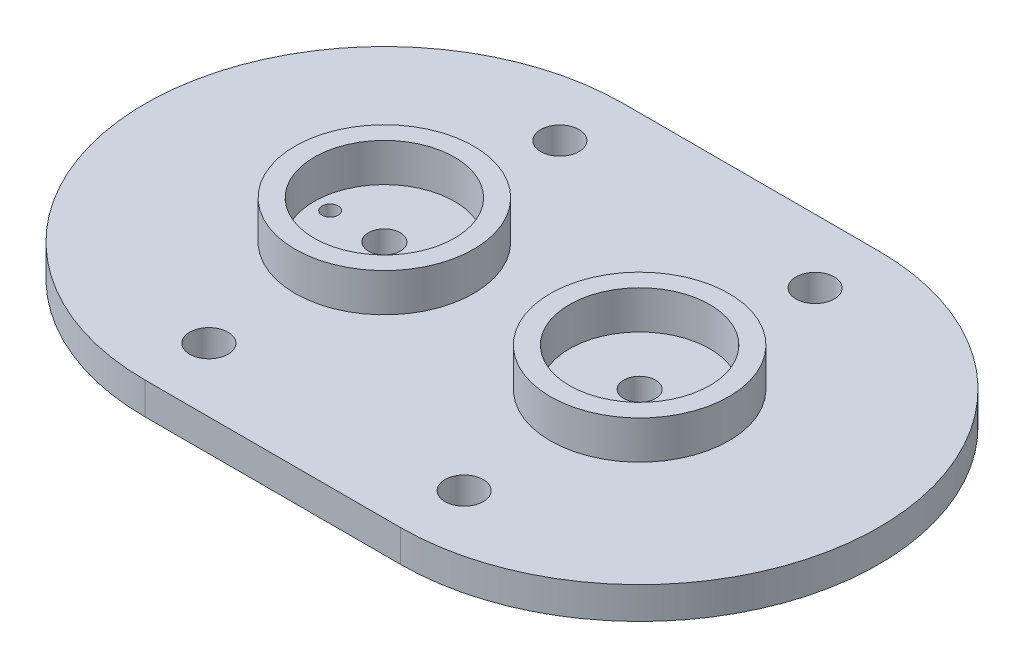
ISO-10303-21;
HEADER;
FILE_DESCRIPTION(('STEP AP214'),'2;1');
FILE_NAME('part.step','',(''),(''),'','','');
FILE_SCHEMA(('AUTOMOTIVE_DESIGN { 1 0 10303 214 1 1 1 1 }'));
ENDSEC;
DATA;
#1=APPLICATION_CONTEXT('core data for automotive mechanical design processes');
#2=APPLICATION_PROTOCOL_DEFINITION('international standard','automotive_design',2000,#1);
#3=PRODUCT_CONTEXT('',#1,'mechanical');
#4=PRODUCT('Part','Part','',(#3));
#5=PRODUCT_RELATED_PRODUCT_CATEGORY('part','',(#4));
#6=PRODUCT_DEFINITION_FORMATION('','',#4);
#7=PRODUCT_DEFINITION_CONTEXT('part definition',#1,'design');
#8=PRODUCT_DEFINITION('design','',#6,#7);
#9=PRODUCT_DEFINITION_SHAPE('','',#8);
#10=(LENGTH_UNIT() NAMED_UNIT(*) SI_UNIT(.MILLI.,.METRE.));
#11=(NAMED_UNIT(*) PLANE_ANGLE_UNIT() SI_UNIT($,.RADIAN.));
#12=(NAMED_UNIT(*) SI_UNIT($,.STERADIAN.) SOLID_ANGLE_UNIT());
#13=UNCERTAINTY_MEASURE_WITH_UNIT(LENGTH_MEASURE(1.E-05),#10,'distance_accuracy_value','');
#14=(GEOMETRIC_REPRESENTATION_CONTEXT(3) GLOBAL_UNCERTAINTY_ASSIGNED_CONTEXT((#13)) GLOBAL_UNIT_ASSIGNED_CONTEXT((#10,
#11,#12)) REPRESENTATION_CONTEXT('',''));
#15=CARTESIAN_POINT('',(0.,0.,0.));
#16=DIRECTION('',(0.,0.,1.));
#17=DIRECTION('',(1.,0.,0.));
#18=AXIS2_PLACEMENT_3D('',#15,#16,#17);
#19=CARTESIAN_POINT('',(-20.,2.5,0.));
#20=DIRECTION('',(0.,-1.,0.));
#21=DIRECTION('',(0.,0.,-1.));
#22=AXIS2_PLACEMENT_3D('',#19,#20,#21);
#23=CYLINDRICAL_SURFACE('',#22,37.5);
#24=CARTESIAN_POINT('',(-20.,-2.5,0.));
#25=DIRECTION('',(0.,1.,0.));
#26=DIRECTION('',(0.,0.,1.));
#27=AXIS2_PLACEMENT_3D('',#24,#25,#26);
#28=CIRCLE('',#27,37.5);
#29=CARTESIAN_POINT('',(-20.,-2.5,-37.5));
#30=VERTEX_POINT('',#29);
#31=CARTESIAN_POINT('',(-20.,-2.5,37.5));
#32=VERTEX_POINT('',#31);
#33=EDGE_CURVE('E105',#30,#32,#28,.T.);
#34=ORIENTED_EDGE('',*,*,#33,.T.);
#35=DIRECTION('',(0.,-1.,0.));
#36=VECTOR('',#35,1.);
#37=CARTESIAN_POINT('',(-20.,2.5,37.5));
#38=LINE('',#37,#36);
#39=CARTESIAN_POINT('',(-20.,2.5,37.5));
#40=VERTEX_POINT('',#39);
#41=EDGE_CURVE('E96',#40,#32,#38,.T.);
#42=ORIENTED_EDGE('',*,*,#41,.F.);
#43=CARTESIAN_POINT('',(-20.,2.5,0.));
#44=DIRECTION('',(0.,1.,0.));
#45=DIRECTION('',(0.,0.,1.));
#46=AXIS2_PLACEMENT_3D('',#43,#44,#45);
#47=CIRCLE('',#46,37.5);
#48=CARTESIAN_POINT('',(-20.,2.5,-37.5));
#49=VERTEX_POINT('',#48);
#50=EDGE_CURVE('E90',#49,#40,#47,.T.);
#51=ORIENTED_EDGE('',*,*,#50,.F.);
#52=DIRECTION('',(0.,-1.,0.));
#53=VECTOR('',#52,1.);
#54=CARTESIAN_POINT('',(-20.,2.5,-37.5));
#55=LINE('',#54,#53);
#56=EDGE_CURVE('E101',#49,#30,#55,.T.);
#57=ORIENTED_EDGE('',*,*,#56,.T.);
#58=EDGE_LOOP('',(#34,#42,#51,#57));
#59=FACE_BOUND('',#58,.T.);
#60=ADVANCED_FACE('F37',(#59),#23,.T.);
#61=CARTESIAN_POINT('',(-20.,2.5,37.5));
#62=DIRECTION('',(0.,0.,-1.));
#63=DIRECTION('',(-1.,0.,0.));
#64=AXIS2_PLACEMENT_3D('',#61,#62,#63);
#65=PLANE('',#64);
#66=DIRECTION('',(1.,0.,0.));
#67=VECTOR('',#66,1.);
#68=CARTESIAN_POINT('',(-20.,-2.5,37.5));
#69=LINE('',#68,#67);
#70=CARTESIAN_POINT('',(20.,-2.5,37.5));
#71=VERTEX_POINT('',#70);
#72=EDGE_CURVE('E95',#32,#71,#69,.T.);
#73=ORIENTED_EDGE('',*,*,#72,.T.);
#74=DIRECTION('',(0.,-1.,0.));
#75=VECTOR('',#74,1.);
#76=CARTESIAN_POINT('',(20.,2.5,37.5));
#77=LINE('',#76,#75);
#78=CARTESIAN_POINT('',(20.,2.5,37.5));
#79=VERTEX_POINT('',#78);
#80=EDGE_CURVE('E93',#79,#71,#77,.T.);
#81=ORIENTED_EDGE('',*,*,#80,.F.);
#82=DIRECTION('',(1.,0.,0.));
#83=VECTOR('',#82,1.);
#84=CARTESIAN_POINT('',(-20.,2.5,37.5));
#85=LINE('',#84,#83);
#86=EDGE_CURVE('E85',#40,#79,#85,.T.);
#87=ORIENTED_EDGE('',*,*,#86,.F.);
#88=ORIENTED_EDGE('',*,*,#41,.T.);
#89=EDGE_LOOP('',(#73,#81,#87,#88));
#90=FACE_BOUND('',#89,.T.);
#91=ADVANCED_FACE('F94',(#90),#65,.F.);
#92=CARTESIAN_POINT('',(20.,2.5,0.));
#93=DIRECTION('',(0.,-1.,0.));
#94=DIRECTION('',(0.,0.,-1.));
#95=AXIS2_PLACEMENT_3D('',#92,#93,#94);
#96=CYLINDRICAL_SURFACE('',#95,37.5);
#97=CARTESIAN_POINT('',(20.,-2.5,0.));
#98=DIRECTION('',(0.,1.,0.));
#99=DIRECTION('',(0.,0.,1.));
#100=AXIS2_PLACEMENT_3D('',#97,#98,#99);
#101=CIRCLE('',#100,37.5);
#102=CARTESIAN_POINT('',(20.,-2.5,-37.5));
#103=VERTEX_POINT('',#102);
#104=EDGE_CURVE('E71',#71,#103,#101,.T.);
#105=ORIENTED_EDGE('',*,*,#104,.T.);
#106=DIRECTION('',(0.,-1.,0.));
#107=VECTOR('',#106,1.);
#108=CARTESIAN_POINT('',(20.,2.5,-37.5));
#109=LINE('',#108,#107);
#110=CARTESIAN_POINT('',(20.,2.5,-37.5));
#111=VERTEX_POINT('',#110);
#112=EDGE_CURVE('E97',#111,#103,#109,.T.);
#113=ORIENTED_EDGE('',*,*,#112,.F.);
#114=CARTESIAN_POINT('',(20.,2.5,0.));
#115=DIRECTION('',(0.,1.,0.));
#116=DIRECTION('',(0.,0.,1.));
#117=AXIS2_PLACEMENT_3D('',#114,#115,#116);
#118=CIRCLE('',#117,37.5);
#119=EDGE_CURVE('E88',#79,#111,#118,.T.);
#120=ORIENTED_EDGE('',*,*,#119,.F.);
#121=ORIENTED_EDGE('',*,*,#80,.T.);
#122=EDGE_LOOP('',(#105,#113,#120,#121));
#123=FACE_BOUND('',#122,.T.);
#124=ADVANCED_FACE('F99',(#123),#96,.T.);
#125=CARTESIAN_POINT('',(-20.,2.5,-37.5));
#126=DIRECTION('',(0.,0.,1.));
#127=DIRECTION('',(1.,0.,0.));
#128=AXIS2_PLACEMENT_3D('',#125,#126,#127);
#129=PLANE('',#128);
#130=DIRECTION('',(-1.,0.,0.));
#131=VECTOR('',#130,1.);
#132=CARTESIAN_POINT('',(-20.,-2.5,-37.5));
#133=LINE('',#132,#131);
#134=EDGE_CURVE('E77',#103,#30,#133,.T.);
#135=ORIENTED_EDGE('',*,*,#134,.T.);
#136=ORIENTED_EDGE('',*,*,#56,.F.);
#137=DIRECTION('',(-1.,0.,0.));
#138=VECTOR('',#137,1.);
#139=CARTESIAN_POINT('',(-20.,2.5,-37.5));
#140=LINE('',#139,#138);
#141=EDGE_CURVE('E54',#111,#49,#140,.T.);
#142=ORIENTED_EDGE('',*,*,#141,.F.);
#143=ORIENTED_EDGE('',*,*,#112,.T.);
#144=EDGE_LOOP('',(#135,#136,#142,#143));
#145=FACE_BOUND('',#144,.T.);
#146=ADVANCED_FACE('F190',(#145),#129,.F.);
#147=CARTESIAN_POINT('',(-20.,2.5,0.));
#148=DIRECTION('',(0.,1.,0.));
#149=DIRECTION('',(0.,0.,1.));
#150=AXIS2_PLACEMENT_3D('',#147,#148,#149);
#151=PLANE('',#150);
#152=CARTESIAN_POINT('',(-20.,2.5,27.5));
#153=DIRECTION('',(0.,1.,0.));
#154=DIRECTION('',(0.,0.,1.));
#155=AXIS2_PLACEMENT_3D('',#152,#153,#154);
#156=CIRCLE('',#155,3.);
#157=CARTESIAN_POINT('',(-20.,2.5,30.5));
#158=VERTEX_POINT('',#157);
#159=EDGE_CURVE('E461',#158,#158,#156,.T.);
#160=ORIENTED_EDGE('',*,*,#159,.F.);
#161=EDGE_LOOP('',(#160));
#162=FACE_BOUND('',#161,.T.);
#163=CARTESIAN_POINT('',(20.,2.5,27.5));
#164=DIRECTION('',(0.,1.,0.));
#165=DIRECTION('',(0.,0.,1.));
#166=AXIS2_PLACEMENT_3D('',#163,#164,#165);
#167=CIRCLE('',#166,3.);
#168=CARTESIAN_POINT('',(20.,2.5,30.5));
#169=VERTEX_POINT('',#168);
#170=EDGE_CURVE('E460',#169,#169,#167,.T.);
#171=ORIENTED_EDGE('',*,*,#170,.F.);
#172=EDGE_LOOP('',(#171));
#173=FACE_BOUND('',#172,.T.);
#174=CARTESIAN_POINT('',(20.,2.5,-27.5));
#175=DIRECTION('',(0.,1.,0.));
#176=DIRECTION('',(0.,0.,1.));
#177=AXIS2_PLACEMENT_3D('',#174,#175,#176);
#178=CIRCLE('',#177,3.);
#179=CARTESIAN_POINT('',(20.,2.5,-24.5));
#180=VERTEX_POINT('',#179);
#181=EDGE_CURVE('E467',#180,#180,#178,.T.);
#182=ORIENTED_EDGE('',*,*,#181,.F.);
#183=EDGE_LOOP('',(#182));
#184=FACE_BOUND('',#183,.T.);
#185=CARTESIAN_POINT('',(-20.,2.5,-27.5));
#186=DIRECTION('',(0.,1.,0.));
#187=DIRECTION('',(0.,0.,1.));
#188=AXIS2_PLACEMENT_3D('',#185,#186,#187);
#189=CIRCLE('',#188,3.);
#190=CARTESIAN_POINT('',(-20.,2.5,-24.5));
#191=VERTEX_POINT('',#190);
#192=EDGE_CURVE('E451',#191,#191,#189,.T.);
#193=ORIENTED_EDGE('',*,*,#192,.F.);
#194=EDGE_LOOP('',(#193));
#195=FACE_BOUND('',#194,.T.);
#196=CARTESIAN_POINT('',(20.,2.5,0.));
#197=DIRECTION('',(0.,1.,0.));
#198=DIRECTION('',(0.,0.,1.));
#199=AXIS2_PLACEMENT_3D('',#196,#197,#198);
#200=CIRCLE('',#199,14.);
#201=CARTESIAN_POINT('',(20.,2.5,14.));
#202=VERTEX_POINT('',#201);
#203=EDGE_CURVE('E164',#202,#202,#200,.T.);
#204=ORIENTED_EDGE('',*,*,#203,.F.);
#205=EDGE_LOOP('',(#204));
#206=FACE_BOUND('',#205,.T.);
#207=CARTESIAN_POINT('',(-20.,2.5,0.));
#208=DIRECTION('',(0.,1.,0.));
#209=DIRECTION('',(0.,0.,1.));
#210=AXIS2_PLACEMENT_3D('',#207,#208,#209);
#211=CIRCLE('',#210,14.);
#212=CARTESIAN_POINT('',(-20.,2.5,14.));
#213=VERTEX_POINT('',#212);
#214=EDGE_CURVE('E181',#213,#213,#211,.T.);
#215=ORIENTED_EDGE('',*,*,#214,.F.);
#216=EDGE_LOOP('',(#215));
#217=FACE_BOUND('',#216,.T.);
#218=ORIENTED_EDGE('',*,*,#50,.T.);
#219=ORIENTED_EDGE('',*,*,#86,.T.);
#220=ORIENTED_EDGE('',*,*,#119,.T.);
#221=ORIENTED_EDGE('',*,*,#141,.T.);
#222=EDGE_LOOP('',(#218,#219,#220,#221));
#223=FACE_BOUND('',#222,.T.);
#224=ADVANCED_FACE('F86',(#162,#173,#184,#195,#206,#217,#223),#151,.T.);
#225=CARTESIAN_POINT('',(-20.,-2.5,0.));
#226=DIRECTION('',(0.,1.,0.));
#227=DIRECTION('',(0.,0.,1.));
#228=AXIS2_PLACEMENT_3D('',#225,#226,#227);
#229=PLANE('',#228);
#230=CARTESIAN_POINT('',(-20.,-2.5,27.5));
#231=DIRECTION('',(0.,1.,0.));
#232=DIRECTION('',(0.,0.,1.));
#233=AXIS2_PLACEMENT_3D('',#230,#231,#232);
#234=CIRCLE('',#233,3.);
#235=CARTESIAN_POINT('',(-20.,-2.5,30.5));
#236=VERTEX_POINT('',#235);
#237=EDGE_CURVE('E457',#236,#236,#234,.F.);
#238=ORIENTED_EDGE('',*,*,#237,.F.);
#239=EDGE_LOOP('',(#238));
#240=FACE_BOUND('',#239,.T.);
#241=CARTESIAN_POINT('',(20.,-2.5,27.5));
#242=DIRECTION('',(0.,1.,0.));
#243=DIRECTION('',(0.,0.,1.));
#244=AXIS2_PLACEMENT_3D('',#241,#242,#243);
#245=CIRCLE('',#244,3.);
#246=CARTESIAN_POINT('',(20.,-2.5,30.5));
#247=VERTEX_POINT('',#246);
#248=EDGE_CURVE('E464',#247,#247,#245,.F.);
#249=ORIENTED_EDGE('',*,*,#248,.F.);
#250=EDGE_LOOP('',(#249));
#251=FACE_BOUND('',#250,.T.);
#252=CARTESIAN_POINT('',(20.,-2.5,-27.5));
#253=DIRECTION('',(0.,1.,0.));
#254=DIRECTION('',(0.,0.,1.));
#255=AXIS2_PLACEMENT_3D('',#252,#253,#254);
#256=CIRCLE('',#255,3.);
#257=CARTESIAN_POINT('',(20.,-2.5,-24.5));
#258=VERTEX_POINT('',#257);
#259=EDGE_CURVE('E453',#258,#258,#256,.F.);
#260=ORIENTED_EDGE('',*,*,#259,.F.);
#261=EDGE_LOOP('',(#260));
#262=FACE_BOUND('',#261,.T.);
#263=CARTESIAN_POINT('',(20.,-2.5,0.));
#264=DIRECTION('',(0.,1.,0.));
#265=DIRECTION('',(0.,0.,1.));
#266=AXIS2_PLACEMENT_3D('',#263,#264,#265);
#267=CIRCLE('',#266,2.5);
#268=CARTESIAN_POINT('',(20.,-2.5,2.5));
#269=VERTEX_POINT('',#268);
#270=EDGE_CURVE('E440',#269,#269,#267,.F.);
#271=ORIENTED_EDGE('',*,*,#270,.F.);
#272=EDGE_LOOP('',(#271));
#273=FACE_BOUND('',#272,.T.);
#274=CARTESIAN_POINT('',(-20.,-2.5,-27.5));
#275=DIRECTION('',(0.,1.,0.));
#276=DIRECTION('',(0.,0.,1.));
#277=AXIS2_PLACEMENT_3D('',#274,#275,#276);
#278=CIRCLE('',#277,3.);
#279=CARTESIAN_POINT('',(-20.,-2.5,-24.5));
#280=VERTEX_POINT('',#279);
#281=EDGE_CURVE('E448',#280,#280,#278,.F.);
#282=ORIENTED_EDGE('',*,*,#281,.F.);
#283=EDGE_LOOP('',(#282));
#284=FACE_BOUND('',#283,.T.);
#285=CARTESIAN_POINT('',(-20.,-2.5,0.));
#286=DIRECTION('',(0.,1.,0.));
#287=DIRECTION('',(0.,0.,1.));
#288=AXIS2_PLACEMENT_3D('',#285,#286,#287);
#289=CIRCLE('',#288,16.);
#290=CARTESIAN_POINT('',(-20.,-2.5,16.));
#291=VERTEX_POINT('',#290);
#292=EDGE_CURVE('E46',#291,#291,#289,.T.);
#293=ORIENTED_EDGE('',*,*,#292,.T.);
#294=EDGE_LOOP('',(#293));
#295=FACE_BOUND('',#294,.T.);
#296=ORIENTED_EDGE('',*,*,#33,.F.);
#297=ORIENTED_EDGE('',*,*,#134,.F.);
#298=ORIENTED_EDGE('',*,*,#104,.F.);
#299=ORIENTED_EDGE('',*,*,#72,.F.);
#300=EDGE_LOOP('',(#296,#297,#298,#299));
#301=FACE_BOUND('',#300,.T.);
#302=ADVANCED_FACE('F129',(#240,#251,#262,#273,#284,#295,#301),#229,.F.);
#303=CARTESIAN_POINT('',(-20.,8.5,0.));
#304=DIRECTION('',(0.,1.,0.));
#305=DIRECTION('',(0.,0.,1.));
#306=AXIS2_PLACEMENT_3D('',#303,#304,#305);
#307=PLANE('',#306);
#308=CARTESIAN_POINT('',(-20.,8.5,0.));
#309=DIRECTION('',(0.,1.,0.));
#310=DIRECTION('',(0.,0.,1.));
#311=AXIS2_PLACEMENT_3D('',#308,#309,#310);
#312=CIRCLE('',#311,14.);
#313=CARTESIAN_POINT('',(-20.,8.5,14.));
#314=VERTEX_POINT('',#313);
#315=EDGE_CURVE('E108',#314,#314,#312,.T.);
#316=ORIENTED_EDGE('',*,*,#315,.T.);
#317=EDGE_LOOP('',(#316));
#318=FACE_BOUND('',#317,.T.);
#319=CARTESIAN_POINT('',(-20.,8.5,0.));
#320=DIRECTION('',(0.,1.,0.));
#321=DIRECTION('',(0.,0.,1.));
#322=AXIS2_PLACEMENT_3D('',#319,#320,#321);
#323=CIRCLE('',#322,11.);
#324=CARTESIAN_POINT('',(-20.,8.5,11.));
#325=VERTEX_POINT('',#324);
#326=EDGE_CURVE('E176',#325,#325,#323,.T.);
#327=ORIENTED_EDGE('',*,*,#326,.F.);
#328=EDGE_LOOP('',(#327));
#329=FACE_BOUND('',#328,.T.);
#330=ADVANCED_FACE('F198',(#318,#329),#307,.T.);
#331=CARTESIAN_POINT('',(-20.,8.5,0.));
#332=DIRECTION('',(0.,-1.,0.));
#333=DIRECTION('',(0.,0.,-1.));
#334=AXIS2_PLACEMENT_3D('',#331,#332,#333);
#335=CYLINDRICAL_SURFACE('',#334,14.);
#336=ORIENTED_EDGE('',*,*,#315,.F.);
#337=EDGE_LOOP('',(#336));
#338=FACE_BOUND('',#337,.T.);
#339=ORIENTED_EDGE('',*,*,#214,.T.);
#340=EDGE_LOOP('',(#339));
#341=FACE_BOUND('',#340,.T.);
#342=ADVANCED_FACE('F187',(#338,#341),#335,.T.);
#343=CARTESIAN_POINT('',(-20.,8.5,0.));
#344=DIRECTION('',(0.,-1.,0.));
#345=DIRECTION('',(0.,0.,-1.));
#346=AXIS2_PLACEMENT_3D('',#343,#344,#345);
#347=CYLINDRICAL_SURFACE('',#346,11.);
#348=ORIENTED_EDGE('',*,*,#326,.T.);
#349=EDGE_LOOP('',(#348));
#350=FACE_BOUND('',#349,.T.);
#351=CARTESIAN_POINT('',(-20.,2.5,0.));
#352=DIRECTION('',(0.,1.,0.));
#353=DIRECTION('',(0.,0.,1.));
#354=AXIS2_PLACEMENT_3D('',#351,#352,#353);
#355=CIRCLE('',#354,11.);
#356=CARTESIAN_POINT('',(-20.,2.5,11.));
#357=VERTEX_POINT('',#356);
#358=EDGE_CURVE('E115',#357,#357,#355,.F.);
#359=ORIENTED_EDGE('',*,*,#358,.T.);
#360=EDGE_LOOP('',(#359));
#361=FACE_BOUND('',#360,.T.);
#362=ADVANCED_FACE('F210',(#350,#361),#347,.F.);
#363=CARTESIAN_POINT('',(-20.,2.5,0.));
#364=DIRECTION('',(0.,1.,0.));
#365=DIRECTION('',(0.,0.,1.));
#366=AXIS2_PLACEMENT_3D('',#363,#364,#365);
#367=CIRCLE('',#366,2.5);
#368=CARTESIAN_POINT('',(-20.,2.5,2.5));
#369=VERTEX_POINT('',#368);
#370=EDGE_CURVE('E433',#369,#369,#367,.T.);
#371=ORIENTED_EDGE('',*,*,#370,.F.);
#372=EDGE_LOOP('',(#371));
#373=FACE_BOUND('',#372,.T.);
#374=CARTESIAN_POINT('',(-28.5,2.5,0.));
#375=DIRECTION('',(0.,1.,0.));
#376=DIRECTION('',(0.,0.,1.));
#377=AXIS2_PLACEMENT_3D('',#374,#375,#376);
#378=CIRCLE('',#377,1.265);
#379=CARTESIAN_POINT('',(-28.5,2.5,1.265));
#380=VERTEX_POINT('',#379);
#381=EDGE_CURVE('E167',#380,#380,#378,.T.);
#382=ORIENTED_EDGE('',*,*,#381,.F.);
#383=EDGE_LOOP('',(#382));
#384=FACE_BOUND('',#383,.T.);
#385=CARTESIAN_POINT('',(-11.5,2.5,0.));
#386=DIRECTION('',(0.,1.,0.));
#387=DIRECTION('',(0.,0.,1.));
#388=AXIS2_PLACEMENT_3D('',#385,#386,#387);
#389=CIRCLE('',#388,1.265);
#390=CARTESIAN_POINT('',(-11.5,2.5,1.265));
#391=VERTEX_POINT('',#390);
#392=EDGE_CURVE('E438',#391,#391,#389,.T.);
#393=ORIENTED_EDGE('',*,*,#392,.F.);
#394=EDGE_LOOP('',(#393));
#395=FACE_BOUND('',#394,.T.);
#396=ORIENTED_EDGE('',*,*,#358,.F.);
#397=EDGE_LOOP('',(#396));
#398=FACE_BOUND('',#397,.T.);
#399=ADVANCED_FACE('F193',(#373,#384,#395,#398),#151,.T.);
#400=CARTESIAN_POINT('',(20.,8.5,0.));
#401=DIRECTION('',(0.,1.,0.));
#402=DIRECTION('',(0.,0.,1.));
#403=AXIS2_PLACEMENT_3D('',#400,#401,#402);
#404=PLANE('',#403);
#405=CARTESIAN_POINT('',(20.,8.5,0.));
#406=DIRECTION('',(0.,1.,0.));
#407=DIRECTION('',(0.,0.,1.));
#408=AXIS2_PLACEMENT_3D('',#405,#406,#407);
#409=CIRCLE('',#408,14.);
#410=CARTESIAN_POINT('',(20.,8.5,14.));
#411=VERTEX_POINT('',#410);
#412=EDGE_CURVE('E173',#411,#411,#409,.T.);
#413=ORIENTED_EDGE('',*,*,#412,.T.);
#414=EDGE_LOOP('',(#413));
#415=FACE_BOUND('',#414,.T.);
#416=CARTESIAN_POINT('',(20.,8.5,0.));
#417=DIRECTION('',(0.,1.,0.));
#418=DIRECTION('',(0.,0.,1.));
#419=AXIS2_PLACEMENT_3D('',#416,#417,#418);
#420=CIRCLE('',#419,11.);
#421=CARTESIAN_POINT('',(20.,8.5,11.));
#422=VERTEX_POINT('',#421);
#423=EDGE_CURVE('E160',#422,#422,#420,.T.);
#424=ORIENTED_EDGE('',*,*,#423,.F.);
#425=EDGE_LOOP('',(#424));
#426=FACE_BOUND('',#425,.T.);
#427=ADVANCED_FACE('F209',(#415,#426),#404,.T.);
#428=CARTESIAN_POINT('',(20.,8.5,0.));
#429=DIRECTION('',(0.,-1.,0.));
#430=DIRECTION('',(0.,0.,-1.));
#431=AXIS2_PLACEMENT_3D('',#428,#429,#430);
#432=CYLINDRICAL_SURFACE('',#431,14.);
#433=ORIENTED_EDGE('',*,*,#412,.F.);
#434=EDGE_LOOP('',(#433));
#435=FACE_BOUND('',#434,.T.);
#436=ORIENTED_EDGE('',*,*,#203,.T.);
#437=EDGE_LOOP('',(#436));
#438=FACE_BOUND('',#437,.T.);
#439=ADVANCED_FACE('F268',(#435,#438),#432,.T.);
#440=CARTESIAN_POINT('',(20.,8.5,0.));
#441=DIRECTION('',(0.,-1.,0.));
#442=DIRECTION('',(0.,0.,-1.));
#443=AXIS2_PLACEMENT_3D('',#440,#441,#442);
#444=CYLINDRICAL_SURFACE('',#443,11.);
#445=ORIENTED_EDGE('',*,*,#423,.T.);
#446=EDGE_LOOP('',(#445));
#447=FACE_BOUND('',#446,.T.);
#448=CARTESIAN_POINT('',(20.,2.5,0.));
#449=DIRECTION('',(0.,1.,0.));
#450=DIRECTION('',(0.,0.,1.));
#451=AXIS2_PLACEMENT_3D('',#448,#449,#450);
#452=CIRCLE('',#451,11.);
#453=CARTESIAN_POINT('',(20.,2.5,11.));
#454=VERTEX_POINT('',#453);
#455=EDGE_CURVE('E118',#454,#454,#452,.F.);
#456=ORIENTED_EDGE('',*,*,#455,.T.);
#457=EDGE_LOOP('',(#456));
#458=FACE_BOUND('',#457,.T.);
#459=ADVANCED_FACE('F206',(#447,#458),#444,.F.);
#460=CARTESIAN_POINT('',(20.,2.5,0.));
#461=DIRECTION('',(0.,1.,0.));
#462=DIRECTION('',(0.,0.,1.));
#463=AXIS2_PLACEMENT_3D('',#460,#461,#462);
#464=CIRCLE('',#463,2.5);
#465=CARTESIAN_POINT('',(20.,2.5,2.5));
#466=VERTEX_POINT('',#465);
#467=EDGE_CURVE('E442',#466,#466,#464,.T.);
#468=ORIENTED_EDGE('',*,*,#467,.F.);
#469=EDGE_LOOP('',(#468));
#470=FACE_BOUND('',#469,.T.);
#471=ORIENTED_EDGE('',*,*,#455,.F.);
#472=EDGE_LOOP('',(#471));
#473=FACE_BOUND('',#472,.T.);
#474=ADVANCED_FACE('F153',(#470,#473),#151,.T.);
#475=CARTESIAN_POINT('',(-20.,-5.,0.));
#476=DIRECTION('',(0.,-1.,0.));
#477=DIRECTION('',(0.,0.,-1.));
#478=AXIS2_PLACEMENT_3D('',#475,#476,#477);
#479=PLANE('',#478);
#480=CARTESIAN_POINT('',(-28.5,-5.,0.));
#481=DIRECTION('',(0.,-1.,0.));
#482=DIRECTION('',(0.,0.,-1.));
#483=AXIS2_PLACEMENT_3D('',#480,#481,#482);
#484=CIRCLE('',#483,1.265);
#485=CARTESIAN_POINT('',(-28.5,-5.,-1.265));
#486=VERTEX_POINT('',#485);
#487=EDGE_CURVE('E447',#486,#486,#484,.F.);
#488=ORIENTED_EDGE('',*,*,#487,.T.);
#489=EDGE_LOOP('',(#488));
#490=FACE_BOUND('',#489,.T.);
#491=CARTESIAN_POINT('',(-11.5,-5.,0.));
#492=DIRECTION('',(0.,-1.,0.));
#493=DIRECTION('',(0.,0.,-1.));
#494=AXIS2_PLACEMENT_3D('',#491,#492,#493);
#495=CIRCLE('',#494,1.265);
#496=CARTESIAN_POINT('',(-11.5,-5.,-1.265));
#497=VERTEX_POINT('',#496);
#498=EDGE_CURVE('E436',#497,#497,#495,.F.);
#499=ORIENTED_EDGE('',*,*,#498,.T.);
#500=EDGE_LOOP('',(#499));
#501=FACE_BOUND('',#500,.T.);
#502=CARTESIAN_POINT('',(-20.,-5.,0.));
#503=DIRECTION('',(0.,-1.,0.));
#504=DIRECTION('',(0.,0.,-1.));
#505=AXIS2_PLACEMENT_3D('',#502,#503,#504);
#506=CIRCLE('',#505,14.);
#507=CARTESIAN_POINT('',(-20.,-5.,-14.));
#508=VERTEX_POINT('',#507);
#509=EDGE_CURVE('E11',#508,#508,#506,.T.);
#510=ORIENTED_EDGE('',*,*,#509,.T.);
#511=EDGE_LOOP('',(#510));
#512=FACE_BOUND('',#511,.T.);
#513=CARTESIAN_POINT('',(-20.,-5.,0.));
#514=DIRECTION('',(0.,-1.,0.));
#515=DIRECTION('',(0.,0.,-1.));
#516=AXIS2_PLACEMENT_3D('',#513,#514,#515);
#517=CIRCLE('',#516,3.75);
#518=CARTESIAN_POINT('',(-20.,-5.,-3.75));
#519=VERTEX_POINT('',#518);
#520=EDGE_CURVE('E158',#519,#519,#517,.T.);
#521=ORIENTED_EDGE('',*,*,#520,.F.);
#522=EDGE_LOOP('',(#521));
#523=FACE_BOUND('',#522,.T.);
#524=ADVANCED_FACE('F142',(#490,#501,#512,#523),#479,.T.);
#525=CARTESIAN_POINT('',(-20.,-5.,0.));
#526=DIRECTION('',(0.,1.,0.));
#527=DIRECTION('',(0.,0.,1.));
#528=AXIS2_PLACEMENT_3D('',#525,#526,#527);
#529=CYLINDRICAL_SURFACE('',#528,15.);
#530=CARTESIAN_POINT('',(-20.,-3.5,0.));
#531=DIRECTION('',(0.,1.,0.));
#532=DIRECTION('',(0.,0.,1.));
#533=AXIS2_PLACEMENT_3D('',#530,#531,#532);
#534=CIRCLE('',#533,15.);
#535=CARTESIAN_POINT('',(-20.,-3.5,15.));
#536=VERTEX_POINT('',#535);
#537=EDGE_CURVE('E124',#536,#536,#534,.F.);
#538=ORIENTED_EDGE('',*,*,#537,.T.);
#539=EDGE_LOOP('',(#538));
#540=FACE_BOUND('',#539,.T.);
#541=CARTESIAN_POINT('',(-20.,-4.,0.));
#542=DIRECTION('',(0.,-1.,0.));
#543=DIRECTION('',(0.,0.,-1.));
#544=AXIS2_PLACEMENT_3D('',#541,#542,#543);
#545=CIRCLE('',#544,15.);
#546=CARTESIAN_POINT('',(-20.,-4.,-15.));
#547=VERTEX_POINT('',#546);
#548=EDGE_CURVE('E121',#547,#547,#545,.F.);
#549=ORIENTED_EDGE('',*,*,#548,.T.);
#550=EDGE_LOOP('',(#549));
#551=FACE_BOUND('',#550,.T.);
#552=ADVANCED_FACE('F138',(#540,#551),#529,.T.);
#553=CARTESIAN_POINT('',(-20.,-5.,0.));
#554=DIRECTION('',(0.,1.,0.));
#555=DIRECTION('',(0.,0.,1.));
#556=AXIS2_PLACEMENT_3D('',#553,#554,#555);
#557=CYLINDRICAL_SURFACE('',#556,3.75);
#558=ORIENTED_EDGE('',*,*,#520,.T.);
#559=EDGE_LOOP('',(#558));
#560=FACE_BOUND('',#559,.T.);
#561=CARTESIAN_POINT('',(-20.,-2.5,0.));
#562=DIRECTION('',(0.,-1.,0.));
#563=DIRECTION('',(0.,0.,-1.));
#564=AXIS2_PLACEMENT_3D('',#561,#562,#563);
#565=CIRCLE('',#564,3.75);
#566=CARTESIAN_POINT('',(-20.,-2.5,-3.75));
#567=VERTEX_POINT('',#566);
#568=EDGE_CURVE('E161',#567,#567,#565,.T.);
#569=ORIENTED_EDGE('',*,*,#568,.F.);
#570=EDGE_LOOP('',(#569));
#571=FACE_BOUND('',#570,.T.);
#572=ADVANCED_FACE('F141',(#560,#571),#557,.F.);
#573=CARTESIAN_POINT('',(-20.,-2.5,0.));
#574=DIRECTION('',(0.,1.,0.));
#575=DIRECTION('',(0.,0.,1.));
#576=AXIS2_PLACEMENT_3D('',#573,#574,#575);
#577=CIRCLE('',#576,2.5);
#578=CARTESIAN_POINT('',(-20.,-2.5,2.5));
#579=VERTEX_POINT('',#578);
#580=EDGE_CURVE('E170',#579,#579,#577,.F.);
#581=ORIENTED_EDGE('',*,*,#580,.F.);
#582=EDGE_LOOP('',(#581));
#583=FACE_BOUND('',#582,.T.);
#584=ORIENTED_EDGE('',*,*,#568,.T.);
#585=EDGE_LOOP('',(#584));
#586=FACE_BOUND('',#585,.T.);
#587=ADVANCED_FACE('F135',(#583,#586),#229,.F.);
#588=CARTESIAN_POINT('',(-20.,-3.5,0.));
#589=DIRECTION('',(0.,1.,0.));
#590=DIRECTION('',(0.,0.,1.));
#591=AXIS2_PLACEMENT_3D('',#588,#589,#590);
#592=TOROIDAL_SURFACE('',#591,16.,1.);
#593=ORIENTED_EDGE('',*,*,#292,.F.);
#594=EDGE_LOOP('',(#593));
#595=FACE_BOUND('',#594,.T.);
#596=ORIENTED_EDGE('',*,*,#537,.F.);
#597=EDGE_LOOP('',(#596));
#598=FACE_BOUND('',#597,.T.);
#599=ADVANCED_FACE('F132',(#595,#598),#592,.F.);
#600=CARTESIAN_POINT('',(-20.,-4.,0.));
#601=DIRECTION('',(0.,-1.,0.));
#602=DIRECTION('',(0.,0.,-1.));
#603=AXIS2_PLACEMENT_3D('',#600,#601,#602);
#604=TOROIDAL_SURFACE('',#603,14.,1.);
#605=ORIENTED_EDGE('',*,*,#548,.F.);
#606=EDGE_LOOP('',(#605));
#607=FACE_BOUND('',#606,.T.);
#608=ORIENTED_EDGE('',*,*,#509,.F.);
#609=EDGE_LOOP('',(#608));
#610=FACE_BOUND('',#609,.T.);
#611=ADVANCED_FACE('F39',(#607,#610),#604,.T.);
#612=CARTESIAN_POINT('',(-11.5,-5.001,0.));
#613=DIRECTION('',(0.,1.,0.));
#614=DIRECTION('',(0.,0.,1.));
#615=AXIS2_PLACEMENT_3D('',#612,#613,#614);
#616=CYLINDRICAL_SURFACE('',#615,1.265);
#617=ORIENTED_EDGE('',*,*,#498,.F.);
#618=EDGE_LOOP('',(#617));
#619=FACE_BOUND('',#618,.T.);
#620=ORIENTED_EDGE('',*,*,#392,.T.);
#621=EDGE_LOOP('',(#620));
#622=FACE_BOUND('',#621,.T.);
#623=ADVANCED_FACE('F148',(#619,#622),#616,.F.);
#624=CARTESIAN_POINT('',(-28.5,-5.001,0.));
#625=DIRECTION('',(0.,1.,0.));
#626=DIRECTION('',(0.,0.,1.));
#627=AXIS2_PLACEMENT_3D('',#624,#625,#626);
#628=CYLINDRICAL_SURFACE('',#627,1.265);
#629=ORIENTED_EDGE('',*,*,#487,.F.);
#630=EDGE_LOOP('',(#629));
#631=FACE_BOUND('',#630,.T.);
#632=ORIENTED_EDGE('',*,*,#381,.T.);
#633=EDGE_LOOP('',(#632));
#634=FACE_BOUND('',#633,.T.);
#635=ADVANCED_FACE('F357',(#631,#634),#628,.F.);
#636=CARTESIAN_POINT('',(-20.,-5.001,-27.5));
#637=DIRECTION('',(0.,1.,0.));
#638=DIRECTION('',(0.,0.,1.));
#639=AXIS2_PLACEMENT_3D('',#636,#637,#638);
#640=CYLINDRICAL_SURFACE('',#639,3.);
#641=ORIENTED_EDGE('',*,*,#192,.T.);
#642=EDGE_LOOP('',(#641));
#643=FACE_BOUND('',#642,.T.);
#644=ORIENTED_EDGE('',*,*,#281,.T.);
#645=EDGE_LOOP('',(#644));
#646=FACE_BOUND('',#645,.T.);
#647=ADVANCED_FACE('F366',(#643,#646),#640,.F.);
#648=CARTESIAN_POINT('',(20.,-5.001,0.));
#649=DIRECTION('',(0.,1.,0.));
#650=DIRECTION('',(0.,0.,1.));
#651=AXIS2_PLACEMENT_3D('',#648,#649,#650);
#652=CYLINDRICAL_SURFACE('',#651,2.5);
#653=ORIENTED_EDGE('',*,*,#467,.T.);
#654=EDGE_LOOP('',(#653));
#655=FACE_BOUND('',#654,.T.);
#656=ORIENTED_EDGE('',*,*,#270,.T.);
#657=EDGE_LOOP('',(#656));
#658=FACE_BOUND('',#657,.T.);
#659=ADVANCED_FACE('F376',(#655,#658),#652,.F.);
#660=CARTESIAN_POINT('',(20.,-5.001,-27.5));
#661=DIRECTION('',(0.,1.,0.));
#662=DIRECTION('',(0.,0.,1.));
#663=AXIS2_PLACEMENT_3D('',#660,#661,#662);
#664=CYLINDRICAL_SURFACE('',#663,3.);
#665=ORIENTED_EDGE('',*,*,#181,.T.);
#666=EDGE_LOOP('',(#665));
#667=FACE_BOUND('',#666,.T.);
#668=ORIENTED_EDGE('',*,*,#259,.T.);
#669=EDGE_LOOP('',(#668));
#670=FACE_BOUND('',#669,.T.);
#671=ADVANCED_FACE('F386',(#667,#670),#664,.F.);
#672=CARTESIAN_POINT('',(20.,-5.001,27.5));
#673=DIRECTION('',(0.,1.,0.));
#674=DIRECTION('',(0.,0.,1.));
#675=AXIS2_PLACEMENT_3D('',#672,#673,#674);
#676=CYLINDRICAL_SURFACE('',#675,3.);
#677=ORIENTED_EDGE('',*,*,#170,.T.);
#678=EDGE_LOOP('',(#677));
#679=FACE_BOUND('',#678,.T.);
#680=ORIENTED_EDGE('',*,*,#248,.T.);
#681=EDGE_LOOP('',(#680));
#682=FACE_BOUND('',#681,.T.);
#683=ADVANCED_FACE('F396',(#679,#682),#676,.F.);
#684=CARTESIAN_POINT('',(-20.,-5.001,27.5));
#685=DIRECTION('',(0.,1.,0.));
#686=DIRECTION('',(0.,0.,1.));
#687=AXIS2_PLACEMENT_3D('',#684,#685,#686);
#688=CYLINDRICAL_SURFACE('',#687,3.);
#689=ORIENTED_EDGE('',*,*,#159,.T.);
#690=EDGE_LOOP('',(#689));
#691=FACE_BOUND('',#690,.T.);
#692=ORIENTED_EDGE('',*,*,#237,.T.);
#693=EDGE_LOOP('',(#692));
#694=FACE_BOUND('',#693,.T.);
#695=ADVANCED_FACE('F406',(#691,#694),#688,.F.);
#696=CARTESIAN_POINT('',(-20.,-5.001,0.));
#697=DIRECTION('',(0.,1.,0.));
#698=DIRECTION('',(0.,0.,1.));
#699=AXIS2_PLACEMENT_3D('',#696,#697,#698);
#700=CYLINDRICAL_SURFACE('',#699,2.5);
#701=ORIENTED_EDGE('',*,*,#370,.T.);
#702=EDGE_LOOP('',(#701));
#703=FACE_BOUND('',#702,.T.);
#704=ORIENTED_EDGE('',*,*,#580,.T.);
#705=EDGE_LOOP('',(#704));
#706=FACE_BOUND('',#705,.T.);
#707=ADVANCED_FACE('F416',(#703,#706),#700,.F.);
#708=CLOSED_SHELL('',(#60,#91,#124,#146,#224,#302,#330,#342,#362,#399,#427,#439,#459,#474,#524,
#552,#572,#587,#599,#611,#623,#635,#647,#659,#671,#683,#695,#707));
#709=MANIFOLD_SOLID_BREP('B2',#708);
#710=ADVANCED_BREP_SHAPE_REPRESENTATION('',(#18,#709),#14);
#711=SHAPE_DEFINITION_REPRESENTATION(#9,#710);
ENDSEC;
END-ISO-10303-21;
